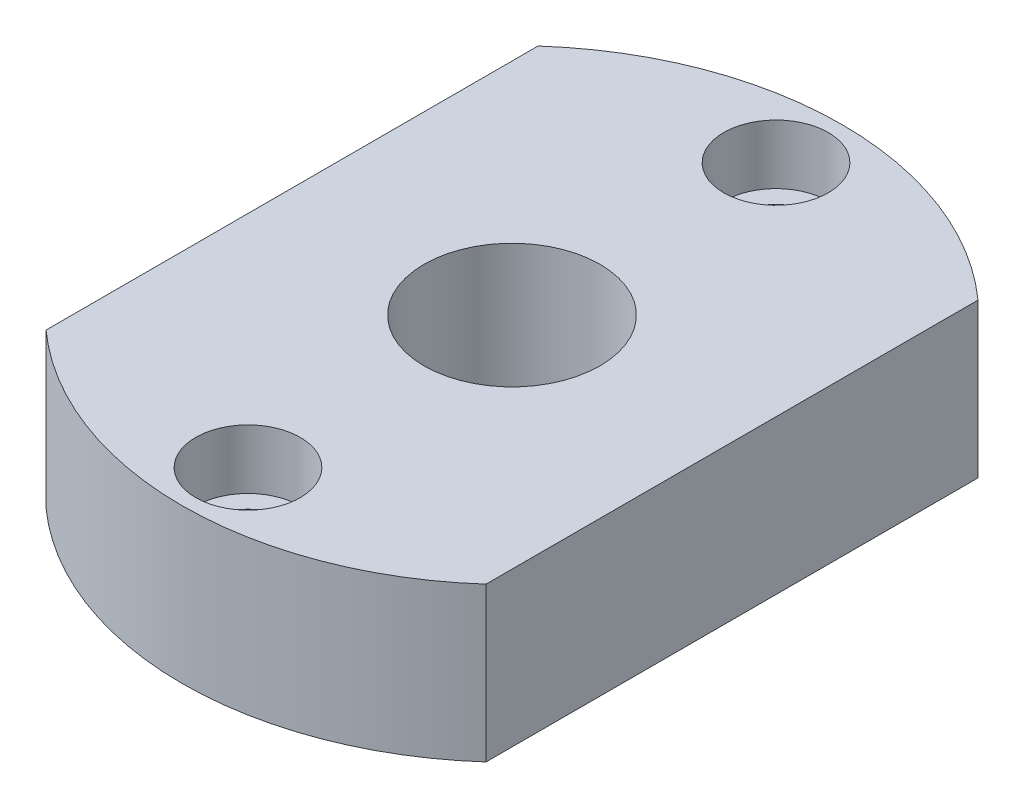
ISO-10303-21;
HEADER;
FILE_DESCRIPTION(('STEP AP214'),'2;1');
FILE_NAME('part.step','',(''),(''),'','','');
FILE_SCHEMA(('AUTOMOTIVE_DESIGN { 1 0 10303 214 1 1 1 1 }'));
ENDSEC;
DATA;
#1=APPLICATION_CONTEXT('core data for automotive mechanical design processes');
#2=APPLICATION_PROTOCOL_DEFINITION('international standard','automotive_design',2000,#1);
#3=PRODUCT_CONTEXT('',#1,'mechanical');
#4=PRODUCT('Part','Part','',(#3));
#5=PRODUCT_RELATED_PRODUCT_CATEGORY('part','',(#4));
#6=PRODUCT_DEFINITION_FORMATION('','',#4);
#7=PRODUCT_DEFINITION_CONTEXT('part definition',#1,'design');
#8=PRODUCT_DEFINITION('design','',#6,#7);
#9=PRODUCT_DEFINITION_SHAPE('','',#8);
#10=(LENGTH_UNIT() NAMED_UNIT(*) SI_UNIT(.MILLI.,.METRE.));
#11=(NAMED_UNIT(*) PLANE_ANGLE_UNIT() SI_UNIT($,.RADIAN.));
#12=(NAMED_UNIT(*) SI_UNIT($,.STERADIAN.) SOLID_ANGLE_UNIT());
#13=UNCERTAINTY_MEASURE_WITH_UNIT(LENGTH_MEASURE(1.E-05),#10,'distance_accuracy_value','');
#14=(GEOMETRIC_REPRESENTATION_CONTEXT(3) GLOBAL_UNCERTAINTY_ASSIGNED_CONTEXT((#13)) GLOBAL_UNIT_ASSIGNED_CONTEXT((#10,
#11,#12)) REPRESENTATION_CONTEXT('',''));
#15=CARTESIAN_POINT('',(0.,0.,0.));
#16=DIRECTION('',(0.,0.,1.));
#17=DIRECTION('',(1.,0.,0.));
#18=AXIS2_PLACEMENT_3D('',#15,#16,#17);
#19=CARTESIAN_POINT('',(0.,14.,0.));
#20=DIRECTION('',(0.,-1.,0.));
#21=DIRECTION('',(0.,0.,-1.));
#22=AXIS2_PLACEMENT_3D('',#19,#20,#21);
#23=CYLINDRICAL_SURFACE('',#22,30.);
#24=DIRECTION('',(0.,-1.,0.));
#25=VECTOR('',#24,1.);
#26=CARTESIAN_POINT('',(20.,14.,22.3606797749979));
#27=LINE('',#26,#25);
#28=CARTESIAN_POINT('',(20.,14.,22.3606797749979));
#29=VERTEX_POINT('',#28);
#30=CARTESIAN_POINT('',(20.,0.,22.3606797749979));
#31=VERTEX_POINT('',#30);
#32=EDGE_CURVE('E130',#29,#31,#27,.T.);
#33=ORIENTED_EDGE('',*,*,#32,.F.);
#34=CARTESIAN_POINT('',(0.,14.,0.));
#35=DIRECTION('',(0.,1.,0.));
#36=DIRECTION('',(0.,0.,1.));
#37=AXIS2_PLACEMENT_3D('',#34,#35,#36);
#38=CIRCLE('',#37,30.);
#39=CARTESIAN_POINT('',(-20.,14.,22.3606797749979));
#40=VERTEX_POINT('',#39);
#41=EDGE_CURVE('E101',#40,#29,#38,.T.);
#42=ORIENTED_EDGE('',*,*,#41,.F.);
#43=DIRECTION('',(0.,-1.,0.));
#44=VECTOR('',#43,1.);
#45=CARTESIAN_POINT('',(-20.,14.,22.3606797749979));
#46=LINE('',#45,#44);
#47=CARTESIAN_POINT('',(-20.,0.,22.3606797749979));
#48=VERTEX_POINT('',#47);
#49=EDGE_CURVE('E84',#48,#40,#46,.F.);
#50=ORIENTED_EDGE('',*,*,#49,.F.);
#51=CARTESIAN_POINT('',(0.,0.,0.));
#52=DIRECTION('',(0.,1.,0.));
#53=DIRECTION('',(0.,0.,1.));
#54=AXIS2_PLACEMENT_3D('',#51,#52,#53);
#55=CIRCLE('',#54,30.);
#56=EDGE_CURVE('E107',#48,#31,#55,.T.);
#57=ORIENTED_EDGE('',*,*,#56,.T.);
#58=EDGE_LOOP('',(#33,#42,#50,#57));
#59=FACE_BOUND('',#58,.T.);
#60=ADVANCED_FACE('F45',(#59),#23,.T.);
#61=DIRECTION('',(0.,-1.,0.));
#62=VECTOR('',#61,1.);
#63=CARTESIAN_POINT('',(20.,14.,-22.3606797749979));
#64=LINE('',#63,#62);
#65=CARTESIAN_POINT('',(20.,0.,-22.3606797749979));
#66=VERTEX_POINT('',#65);
#67=CARTESIAN_POINT('',(20.,14.,-22.3606797749979));
#68=VERTEX_POINT('',#67);
#69=EDGE_CURVE('E100',#66,#68,#64,.F.);
#70=ORIENTED_EDGE('',*,*,#69,.F.);
#71=CARTESIAN_POINT('',(-20.,0.,-22.3606797749979));
#72=VERTEX_POINT('',#71);
#73=EDGE_CURVE('E96',#66,#72,#55,.T.);
#74=ORIENTED_EDGE('',*,*,#73,.T.);
#75=DIRECTION('',(0.,-1.,0.));
#76=VECTOR('',#75,1.);
#77=CARTESIAN_POINT('',(-20.,14.,-22.3606797749979));
#78=LINE('',#77,#76);
#79=CARTESIAN_POINT('',(-20.,14.,-22.3606797749979));
#80=VERTEX_POINT('',#79);
#81=EDGE_CURVE('E85',#80,#72,#78,.T.);
#82=ORIENTED_EDGE('',*,*,#81,.F.);
#83=EDGE_CURVE('E94',#68,#80,#38,.T.);
#84=ORIENTED_EDGE('',*,*,#83,.F.);
#85=EDGE_LOOP('',(#70,#74,#82,#84));
#86=FACE_BOUND('',#85,.T.);
#87=ADVANCED_FACE('F91',(#86),#23,.T.);
#88=CARTESIAN_POINT('',(0.,14.,0.));
#89=DIRECTION('',(0.,1.,0.));
#90=DIRECTION('',(0.,0.,1.));
#91=AXIS2_PLACEMENT_3D('',#88,#89,#90);
#92=PLANE('',#91);
#93=CARTESIAN_POINT('',(0.,14.,-24.));
#94=DIRECTION('',(0.,1.,0.));
#95=DIRECTION('',(0.,0.,1.));
#96=AXIS2_PLACEMENT_3D('',#93,#94,#95);
#97=CIRCLE('',#96,4.75);
#98=CARTESIAN_POINT('',(0.,14.,-19.25));
#99=VERTEX_POINT('',#98);
#100=EDGE_CURVE('E118',#99,#99,#97,.T.);
#101=ORIENTED_EDGE('',*,*,#100,.F.);
#102=EDGE_LOOP('',(#101));
#103=FACE_BOUND('',#102,.T.);
#104=CARTESIAN_POINT('',(0.,14.,24.));
#105=DIRECTION('',(0.,1.,0.));
#106=DIRECTION('',(0.,0.,1.));
#107=AXIS2_PLACEMENT_3D('',#104,#105,#106);
#108=CIRCLE('',#107,4.75);
#109=CARTESIAN_POINT('',(0.,14.,28.75));
#110=VERTEX_POINT('',#109);
#111=EDGE_CURVE('E121',#110,#110,#108,.T.);
#112=ORIENTED_EDGE('',*,*,#111,.F.);
#113=EDGE_LOOP('',(#112));
#114=FACE_BOUND('',#113,.T.);
#115=CARTESIAN_POINT('',(0.,14.,0.));
#116=DIRECTION('',(0.,1.,0.));
#117=DIRECTION('',(0.,0.,1.));
#118=AXIS2_PLACEMENT_3D('',#115,#116,#117);
#119=CIRCLE('',#118,8.);
#120=CARTESIAN_POINT('',(0.,14.,8.));
#121=VERTEX_POINT('',#120);
#122=EDGE_CURVE('E106',#121,#121,#119,.T.);
#123=ORIENTED_EDGE('',*,*,#122,.F.);
#124=EDGE_LOOP('',(#123));
#125=FACE_BOUND('',#124,.T.);
#126=ORIENTED_EDGE('',*,*,#41,.T.);
#127=DIRECTION('',(0.,0.,-1.));
#128=VECTOR('',#127,1.);
#129=CARTESIAN_POINT('',(20.,14.,32.5));
#130=LINE('',#129,#128);
#131=EDGE_CURVE('E86',#29,#68,#130,.T.);
#132=ORIENTED_EDGE('',*,*,#131,.T.);
#133=ORIENTED_EDGE('',*,*,#83,.T.);
#134=DIRECTION('',(0.,0.,1.));
#135=VECTOR('',#134,1.);
#136=CARTESIAN_POINT('',(-20.,14.,32.5));
#137=LINE('',#136,#135);
#138=EDGE_CURVE('E78',#80,#40,#137,.T.);
#139=ORIENTED_EDGE('',*,*,#138,.T.);
#140=EDGE_LOOP('',(#126,#132,#133,#139));
#141=FACE_BOUND('',#140,.T.);
#142=ADVANCED_FACE('F99',(#103,#114,#125,#141),#92,.T.);
#143=CARTESIAN_POINT('',(0.,0.,0.));
#144=DIRECTION('',(0.,1.,0.));
#145=DIRECTION('',(0.,0.,1.));
#146=AXIS2_PLACEMENT_3D('',#143,#144,#145);
#147=PLANE('',#146);
#148=CARTESIAN_POINT('',(0.,0.,-24.));
#149=DIRECTION('',(0.,1.,0.));
#150=DIRECTION('',(0.,0.,1.));
#151=AXIS2_PLACEMENT_3D('',#148,#149,#150);
#152=CIRCLE('',#151,3.);
#153=CARTESIAN_POINT('',(0.,0.,-21.));
#154=VERTEX_POINT('',#153);
#155=EDGE_CURVE('E135',#154,#154,#152,.T.);
#156=ORIENTED_EDGE('',*,*,#155,.T.);
#157=EDGE_LOOP('',(#156));
#158=FACE_BOUND('',#157,.T.);
#159=CARTESIAN_POINT('',(0.,0.,24.));
#160=DIRECTION('',(0.,1.,0.));
#161=DIRECTION('',(0.,0.,-1.));
#162=AXIS2_PLACEMENT_3D('',#159,#160,#161);
#163=CIRCLE('',#162,3.);
#164=CARTESIAN_POINT('',(0.,0.,21.));
#165=VERTEX_POINT('',#164);
#166=EDGE_CURVE('E117',#165,#165,#163,.T.);
#167=ORIENTED_EDGE('',*,*,#166,.T.);
#168=EDGE_LOOP('',(#167));
#169=FACE_BOUND('',#168,.T.);
#170=CARTESIAN_POINT('',(0.,0.,0.));
#171=DIRECTION('',(0.,1.,0.));
#172=DIRECTION('',(0.,0.,1.));
#173=AXIS2_PLACEMENT_3D('',#170,#171,#172);
#174=CIRCLE('',#173,8.);
#175=CARTESIAN_POINT('',(0.,0.,8.));
#176=VERTEX_POINT('',#175);
#177=EDGE_CURVE('E109',#176,#176,#174,.T.);
#178=ORIENTED_EDGE('',*,*,#177,.T.);
#179=EDGE_LOOP('',(#178));
#180=FACE_BOUND('',#179,.T.);
#181=DIRECTION('',(0.,0.,-1.));
#182=VECTOR('',#181,1.);
#183=CARTESIAN_POINT('',(20.,0.,32.5));
#184=LINE('',#183,#182);
#185=EDGE_CURVE('E12',#31,#66,#184,.T.);
#186=ORIENTED_EDGE('',*,*,#185,.F.);
#187=ORIENTED_EDGE('',*,*,#56,.F.);
#188=DIRECTION('',(0.,0.,1.));
#189=VECTOR('',#188,1.);
#190=CARTESIAN_POINT('',(-20.,0.,32.5));
#191=LINE('',#190,#189);
#192=EDGE_CURVE('E49',#72,#48,#191,.T.);
#193=ORIENTED_EDGE('',*,*,#192,.F.);
#194=ORIENTED_EDGE('',*,*,#73,.F.);
#195=EDGE_LOOP('',(#186,#187,#193,#194));
#196=FACE_BOUND('',#195,.T.);
#197=ADVANCED_FACE('F146',(#158,#169,#180,#196),#147,.F.);
#198=CARTESIAN_POINT('',(0.,0.,24.));
#199=DIRECTION('',(0.,1.,0.));
#200=DIRECTION('',(0.,0.,1.));
#201=AXIS2_PLACEMENT_3D('',#198,#199,#200);
#202=CYLINDRICAL_SURFACE('',#201,3.);
#203=ORIENTED_EDGE('',*,*,#166,.F.);
#204=EDGE_LOOP('',(#203));
#205=FACE_BOUND('',#204,.T.);
#206=CARTESIAN_POINT('',(0.,8.6,24.));
#207=DIRECTION('',(0.,1.,0.));
#208=DIRECTION('',(0.,0.,1.));
#209=AXIS2_PLACEMENT_3D('',#206,#207,#208);
#210=CIRCLE('',#209,3.);
#211=CARTESIAN_POINT('',(0.,8.6,27.));
#212=VERTEX_POINT('',#211);
#213=EDGE_CURVE('E44',#212,#212,#210,.F.);
#214=ORIENTED_EDGE('',*,*,#213,.F.);
#215=EDGE_LOOP('',(#214));
#216=FACE_BOUND('',#215,.T.);
#217=ADVANCED_FACE('F154',(#205,#216),#202,.F.);
#218=CARTESIAN_POINT('',(0.,0.,-24.));
#219=DIRECTION('',(0.,1.,0.));
#220=DIRECTION('',(0.,0.,1.));
#221=AXIS2_PLACEMENT_3D('',#218,#219,#220);
#222=CYLINDRICAL_SURFACE('',#221,3.);
#223=ORIENTED_EDGE('',*,*,#155,.F.);
#224=EDGE_LOOP('',(#223));
#225=FACE_BOUND('',#224,.T.);
#226=CARTESIAN_POINT('',(0.,8.6,-24.));
#227=DIRECTION('',(0.,1.,0.));
#228=DIRECTION('',(0.,0.,1.));
#229=AXIS2_PLACEMENT_3D('',#226,#227,#228);
#230=CIRCLE('',#229,3.);
#231=CARTESIAN_POINT('',(0.,8.6,-21.));
#232=VERTEX_POINT('',#231);
#233=EDGE_CURVE('E112',#232,#232,#230,.F.);
#234=ORIENTED_EDGE('',*,*,#233,.F.);
#235=EDGE_LOOP('',(#234));
#236=FACE_BOUND('',#235,.T.);
#237=ADVANCED_FACE('F195',(#225,#236),#222,.F.);
#238=CARTESIAN_POINT('',(0.,0.,0.));
#239=DIRECTION('',(0.,1.,0.));
#240=DIRECTION('',(0.,0.,1.));
#241=AXIS2_PLACEMENT_3D('',#238,#239,#240);
#242=CYLINDRICAL_SURFACE('',#241,8.);
#243=ORIENTED_EDGE('',*,*,#177,.F.);
#244=EDGE_LOOP('',(#243));
#245=FACE_BOUND('',#244,.T.);
#246=ORIENTED_EDGE('',*,*,#122,.T.);
#247=EDGE_LOOP('',(#246));
#248=FACE_BOUND('',#247,.T.);
#249=ADVANCED_FACE('F144',(#245,#248),#242,.F.);
#250=CARTESIAN_POINT('',(0.,8.6,-24.));
#251=DIRECTION('',(0.,1.,0.));
#252=DIRECTION('',(0.,0.,1.));
#253=AXIS2_PLACEMENT_3D('',#250,#251,#252);
#254=PLANE('',#253);
#255=CARTESIAN_POINT('',(0.,8.6,-24.));
#256=DIRECTION('',(0.,1.,0.));
#257=DIRECTION('',(0.,0.,1.));
#258=AXIS2_PLACEMENT_3D('',#255,#256,#257);
#259=CIRCLE('',#258,4.75);
#260=CARTESIAN_POINT('',(0.,8.6,-19.25));
#261=VERTEX_POINT('',#260);
#262=EDGE_CURVE('E114',#261,#261,#259,.T.);
#263=ORIENTED_EDGE('',*,*,#262,.T.);
#264=EDGE_LOOP('',(#263));
#265=FACE_BOUND('',#264,.T.);
#266=ORIENTED_EDGE('',*,*,#233,.T.);
#267=EDGE_LOOP('',(#266));
#268=FACE_BOUND('',#267,.T.);
#269=ADVANCED_FACE('F176',(#265,#268),#254,.T.);
#270=CARTESIAN_POINT('',(0.,8.6,-24.));
#271=DIRECTION('',(0.,1.,0.));
#272=DIRECTION('',(0.,0.,1.));
#273=AXIS2_PLACEMENT_3D('',#270,#271,#272);
#274=CYLINDRICAL_SURFACE('',#273,4.75);
#275=CARTESIAN_POINT('',(0.,8.6,-19.25));
#276=CARTESIAN_POINT('',(0.,8.65625,-19.25));
#277=CARTESIAN_POINT('',(0.,8.7125,-19.25));
#278=CARTESIAN_POINT('',(0.,8.825,-19.25));
#279=CARTESIAN_POINT('',(0.,8.88125,-19.25));
#280=CARTESIAN_POINT('',(0.,8.99375,-19.25));
#281=CARTESIAN_POINT('',(0.,9.05,-19.25));
#282=CARTESIAN_POINT('',(0.,9.1625,-19.25));
#283=CARTESIAN_POINT('',(0.,9.21875,-19.25));
#284=CARTESIAN_POINT('',(0.,9.33125,-19.25));
#285=CARTESIAN_POINT('',(0.,9.3875,-19.25));
#286=CARTESIAN_POINT('',(0.,9.5,-19.25));
#287=CARTESIAN_POINT('',(0.,9.55625,-19.25));
#288=CARTESIAN_POINT('',(0.,9.66875,-19.25));
#289=CARTESIAN_POINT('',(0.,9.725,-19.25));
#290=CARTESIAN_POINT('',(0.,9.8375,-19.25));
#291=CARTESIAN_POINT('',(0.,9.89375,-19.25));
#292=CARTESIAN_POINT('',(0.,10.00625,-19.25));
#293=CARTESIAN_POINT('',(0.,10.0625,-19.25));
#294=CARTESIAN_POINT('',(0.,10.175,-19.25));
#295=CARTESIAN_POINT('',(0.,10.23125,-19.25));
#296=CARTESIAN_POINT('',(0.,10.34375,-19.25));
#297=CARTESIAN_POINT('',(0.,10.4,-19.25));
#298=CARTESIAN_POINT('',(0.,10.5125,-19.25));
#299=CARTESIAN_POINT('',(0.,10.56875,-19.25));
#300=CARTESIAN_POINT('',(0.,10.68125,-19.25));
#301=CARTESIAN_POINT('',(0.,10.7375,-19.25));
#302=CARTESIAN_POINT('',(0.,10.85,-19.25));
#303=CARTESIAN_POINT('',(0.,10.90625,-19.25));
#304=CARTESIAN_POINT('',(0.,11.01875,-19.25));
#305=CARTESIAN_POINT('',(0.,11.075,-19.25));
#306=CARTESIAN_POINT('',(0.,11.1875,-19.25));
#307=CARTESIAN_POINT('',(0.,11.24375,-19.25));
#308=CARTESIAN_POINT('',(0.,11.35625,-19.25));
#309=CARTESIAN_POINT('',(0.,11.4125,-19.25));
#310=CARTESIAN_POINT('',(0.,11.525,-19.25));
#311=CARTESIAN_POINT('',(0.,11.58125,-19.25));
#312=CARTESIAN_POINT('',(0.,11.69375,-19.25));
#313=CARTESIAN_POINT('',(0.,11.75,-19.25));
#314=CARTESIAN_POINT('',(0.,11.8625,-19.25));
#315=CARTESIAN_POINT('',(0.,11.91875,-19.25));
#316=CARTESIAN_POINT('',(0.,12.03125,-19.25));
#317=CARTESIAN_POINT('',(0.,12.0875,-19.25));
#318=CARTESIAN_POINT('',(0.,12.2,-19.25));
#319=CARTESIAN_POINT('',(0.,12.25625,-19.25));
#320=CARTESIAN_POINT('',(0.,12.36875,-19.25));
#321=CARTESIAN_POINT('',(0.,12.425,-19.25));
#322=CARTESIAN_POINT('',(0.,12.5375,-19.25));
#323=CARTESIAN_POINT('',(0.,12.59375,-19.25));
#324=CARTESIAN_POINT('',(0.,12.70625,-19.25));
#325=CARTESIAN_POINT('',(0.,12.7625,-19.25));
#326=CARTESIAN_POINT('',(0.,12.875,-19.25));
#327=CARTESIAN_POINT('',(0.,12.93125,-19.25));
#328=CARTESIAN_POINT('',(0.,13.04375,-19.25));
#329=CARTESIAN_POINT('',(0.,13.1,-19.25));
#330=CARTESIAN_POINT('',(0.,13.2125,-19.25));
#331=CARTESIAN_POINT('',(0.,13.26875,-19.25));
#332=CARTESIAN_POINT('',(0.,13.38125,-19.25));
#333=CARTESIAN_POINT('',(0.,13.4375,-19.25));
#334=CARTESIAN_POINT('',(0.,13.55,-19.25));
#335=CARTESIAN_POINT('',(0.,13.60625,-19.25));
#336=CARTESIAN_POINT('',(0.,13.71875,-19.25));
#337=CARTESIAN_POINT('',(0.,13.775,-19.25));
#338=CARTESIAN_POINT('',(0.,13.8875,-19.25));
#339=CARTESIAN_POINT('',(0.,13.94375,-19.25));
#340=CARTESIAN_POINT('',(0.,14.,-19.25));
#341=B_SPLINE_CURVE_WITH_KNOTS('',3,(#275,#276,#277,#278,#279,#280,#281,#282,#283,#284,#285,
#286,#287,#288,#289,#290,#291,#292,#293,#294,#295,#296,#297,#298,#299,#300,#301,#302,#303,#304,
#305,#306,#307,#308,#309,#310,#311,#312,#313,#314,#315,#316,#317,#318,#319,#320,#321,#322,#323,
#324,#325,#326,#327,#328,#329,#330,#331,#332,#333,#334,#335,#336,#337,#338,#339,#340),
.UNSPECIFIED.,.F.,.F.,(4,2,2,2,2,2,2,2,2,2,2,2,2,2,2,2,2,2,2,2,2,2,2,2,2,2,2,2,2,2,2,2,4),(0.,
0.168749999999999,0.337499999999999,0.50625,0.674999999999998,0.843749999999999,1.0125,1.18125,
1.35,1.51875,1.6875,1.85625,2.025,2.19375,2.3625,2.53125,2.7,2.86875,3.0375,3.20625,3.375,
3.54375,3.7125,3.88125,4.05,4.21875,4.3875,4.55625,4.725,4.89375,5.0625,5.23125,5.4),.UNSPECIFIED.);
#342=EDGE_CURVE('BSEAM185',#261,#99,#341,.T.);
#343=ORIENTED_EDGE('',*,*,#262,.F.);
#344=ORIENTED_EDGE('',*,*,#100,.T.);
#345=ORIENTED_EDGE('',*,*,#342,.T.);
#346=ORIENTED_EDGE('',*,*,#342,.F.);
#347=EDGE_LOOP('',(#343,#345,#344,#346));
#348=FACE_BOUND('',#347,.T.);
#349=ADVANCED_FACE('F185',(#348),#274,.F.);
#350=CARTESIAN_POINT('',(0.,8.6,24.));
#351=DIRECTION('',(0.,1.,0.));
#352=DIRECTION('',(0.,0.,1.));
#353=AXIS2_PLACEMENT_3D('',#350,#351,#352);
#354=PLANE('',#353);
#355=CARTESIAN_POINT('',(0.,8.6,24.));
#356=DIRECTION('',(0.,1.,0.));
#357=DIRECTION('',(0.,0.,1.));
#358=AXIS2_PLACEMENT_3D('',#355,#356,#357);
#359=CIRCLE('',#358,4.75);
#360=CARTESIAN_POINT('',(0.,8.6,28.75));
#361=VERTEX_POINT('',#360);
#362=EDGE_CURVE('E132',#361,#361,#359,.T.);
#363=ORIENTED_EDGE('',*,*,#362,.T.);
#364=EDGE_LOOP('',(#363));
#365=FACE_BOUND('',#364,.T.);
#366=ORIENTED_EDGE('',*,*,#213,.T.);
#367=EDGE_LOOP('',(#366));
#368=FACE_BOUND('',#367,.T.);
#369=ADVANCED_FACE('F183',(#365,#368),#354,.T.);
#370=CARTESIAN_POINT('',(0.,8.6,24.));
#371=DIRECTION('',(0.,1.,0.));
#372=DIRECTION('',(0.,0.,1.));
#373=AXIS2_PLACEMENT_3D('',#370,#371,#372);
#374=CYLINDRICAL_SURFACE('',#373,4.75);
#375=CARTESIAN_POINT('',(0.,8.6,28.75));
#376=CARTESIAN_POINT('',(0.,8.65625,28.75));
#377=CARTESIAN_POINT('',(0.,8.7125,28.75));
#378=CARTESIAN_POINT('',(0.,8.825,28.75));
#379=CARTESIAN_POINT('',(0.,8.88125,28.75));
#380=CARTESIAN_POINT('',(0.,8.99375,28.75));
#381=CARTESIAN_POINT('',(0.,9.05,28.75));
#382=CARTESIAN_POINT('',(0.,9.1625,28.75));
#383=CARTESIAN_POINT('',(0.,9.21875,28.75));
#384=CARTESIAN_POINT('',(0.,9.33125,28.75));
#385=CARTESIAN_POINT('',(0.,9.3875,28.75));
#386=CARTESIAN_POINT('',(0.,9.5,28.75));
#387=CARTESIAN_POINT('',(0.,9.55625,28.75));
#388=CARTESIAN_POINT('',(0.,9.66875,28.75));
#389=CARTESIAN_POINT('',(0.,9.725,28.75));
#390=CARTESIAN_POINT('',(0.,9.8375,28.75));
#391=CARTESIAN_POINT('',(0.,9.89375,28.75));
#392=CARTESIAN_POINT('',(0.,10.00625,28.75));
#393=CARTESIAN_POINT('',(0.,10.0625,28.75));
#394=CARTESIAN_POINT('',(0.,10.175,28.75));
#395=CARTESIAN_POINT('',(0.,10.23125,28.75));
#396=CARTESIAN_POINT('',(0.,10.34375,28.75));
#397=CARTESIAN_POINT('',(0.,10.4,28.75));
#398=CARTESIAN_POINT('',(0.,10.5125,28.75));
#399=CARTESIAN_POINT('',(0.,10.56875,28.75));
#400=CARTESIAN_POINT('',(0.,10.68125,28.75));
#401=CARTESIAN_POINT('',(0.,10.7375,28.75));
#402=CARTESIAN_POINT('',(0.,10.85,28.75));
#403=CARTESIAN_POINT('',(0.,10.90625,28.75));
#404=CARTESIAN_POINT('',(0.,11.01875,28.75));
#405=CARTESIAN_POINT('',(0.,11.075,28.75));
#406=CARTESIAN_POINT('',(0.,11.1875,28.75));
#407=CARTESIAN_POINT('',(0.,11.24375,28.75));
#408=CARTESIAN_POINT('',(0.,11.35625,28.75));
#409=CARTESIAN_POINT('',(0.,11.4125,28.75));
#410=CARTESIAN_POINT('',(0.,11.525,28.75));
#411=CARTESIAN_POINT('',(0.,11.58125,28.75));
#412=CARTESIAN_POINT('',(0.,11.69375,28.75));
#413=CARTESIAN_POINT('',(0.,11.75,28.75));
#414=CARTESIAN_POINT('',(0.,11.8625,28.75));
#415=CARTESIAN_POINT('',(0.,11.91875,28.75));
#416=CARTESIAN_POINT('',(0.,12.03125,28.75));
#417=CARTESIAN_POINT('',(0.,12.0875,28.75));
#418=CARTESIAN_POINT('',(0.,12.2,28.75));
#419=CARTESIAN_POINT('',(0.,12.25625,28.75));
#420=CARTESIAN_POINT('',(0.,12.36875,28.75));
#421=CARTESIAN_POINT('',(0.,12.425,28.75));
#422=CARTESIAN_POINT('',(0.,12.5375,28.75));
#423=CARTESIAN_POINT('',(0.,12.59375,28.75));
#424=CARTESIAN_POINT('',(0.,12.70625,28.75));
#425=CARTESIAN_POINT('',(0.,12.7625,28.75));
#426=CARTESIAN_POINT('',(0.,12.875,28.75));
#427=CARTESIAN_POINT('',(0.,12.93125,28.75));
#428=CARTESIAN_POINT('',(0.,13.04375,28.75));
#429=CARTESIAN_POINT('',(0.,13.1,28.75));
#430=CARTESIAN_POINT('',(0.,13.2125,28.75));
#431=CARTESIAN_POINT('',(0.,13.26875,28.75));
#432=CARTESIAN_POINT('',(0.,13.38125,28.75));
#433=CARTESIAN_POINT('',(0.,13.4375,28.75));
#434=CARTESIAN_POINT('',(0.,13.55,28.75));
#435=CARTESIAN_POINT('',(0.,13.60625,28.75));
#436=CARTESIAN_POINT('',(0.,13.71875,28.75));
#437=CARTESIAN_POINT('',(0.,13.775,28.75));
#438=CARTESIAN_POINT('',(0.,13.8875,28.75));
#439=CARTESIAN_POINT('',(0.,13.94375,28.75));
#440=CARTESIAN_POINT('',(0.,14.,28.75));
#441=B_SPLINE_CURVE_WITH_KNOTS('',3,(#375,#376,#377,#378,#379,#380,#381,#382,#383,#384,#385,
#386,#387,#388,#389,#390,#391,#392,#393,#394,#395,#396,#397,#398,#399,#400,#401,#402,#403,#404,
#405,#406,#407,#408,#409,#410,#411,#412,#413,#414,#415,#416,#417,#418,#419,#420,#421,#422,#423,
#424,#425,#426,#427,#428,#429,#430,#431,#432,#433,#434,#435,#436,#437,#438,#439,#440),
.UNSPECIFIED.,.F.,.F.,(4,2,2,2,2,2,2,2,2,2,2,2,2,2,2,2,2,2,2,2,2,2,2,2,2,2,2,2,2,2,2,2,4),(0.,
0.168749999999999,0.337499999999999,0.50625,0.674999999999998,0.843749999999999,1.0125,1.18125,
1.35,1.51875,1.6875,1.85625,2.025,2.19375,2.3625,2.53125,2.7,2.86875,3.0375,3.20625,3.375,
3.54375,3.7125,3.88125,4.05,4.21875,4.3875,4.55625,4.725,4.89375,5.0625,5.23125,5.4),.UNSPECIFIED.);
#442=EDGE_CURVE('BSEAM177',#361,#110,#441,.T.);
#443=ORIENTED_EDGE('',*,*,#362,.F.);
#444=ORIENTED_EDGE('',*,*,#111,.T.);
#445=ORIENTED_EDGE('',*,*,#442,.T.);
#446=ORIENTED_EDGE('',*,*,#442,.F.);
#447=EDGE_LOOP('',(#443,#445,#444,#446));
#448=FACE_BOUND('',#447,.T.);
#449=ADVANCED_FACE('F177',(#448),#374,.F.);
#450=CARTESIAN_POINT('',(-20.,0.,32.5));
#451=DIRECTION('',(-1.,0.,0.));
#452=DIRECTION('',(0.,0.,1.));
#453=AXIS2_PLACEMENT_3D('',#450,#451,#452);
#454=PLANE('',#453);
#455=ORIENTED_EDGE('',*,*,#81,.T.);
#456=ORIENTED_EDGE('',*,*,#192,.T.);
#457=ORIENTED_EDGE('',*,*,#49,.T.);
#458=ORIENTED_EDGE('',*,*,#138,.F.);
#459=EDGE_LOOP('',(#455,#456,#457,#458));
#460=FACE_BOUND('',#459,.T.);
#461=ADVANCED_FACE('F82',(#460),#454,.T.);
#462=CARTESIAN_POINT('',(20.,0.,32.5));
#463=DIRECTION('',(1.,0.,0.));
#464=DIRECTION('',(0.,0.,-1.));
#465=AXIS2_PLACEMENT_3D('',#462,#463,#464);
#466=PLANE('',#465);
#467=ORIENTED_EDGE('',*,*,#32,.T.);
#468=ORIENTED_EDGE('',*,*,#185,.T.);
#469=ORIENTED_EDGE('',*,*,#69,.T.);
#470=ORIENTED_EDGE('',*,*,#131,.F.);
#471=EDGE_LOOP('',(#467,#468,#469,#470));
#472=FACE_BOUND('',#471,.T.);
#473=ADVANCED_FACE('F166',(#472),#466,.T.);
#474=CLOSED_SHELL('',(#60,#87,#142,#197,#217,#237,#249,#269,#349,#369,#449,#461,#473));
#475=MANIFOLD_SOLID_BREP('B2',#474);
#476=ADVANCED_BREP_SHAPE_REPRESENTATION('',(#18,#475),#14);
#477=SHAPE_DEFINITION_REPRESENTATION(#9,#476);
ENDSEC;
END-ISO-10303-21;
